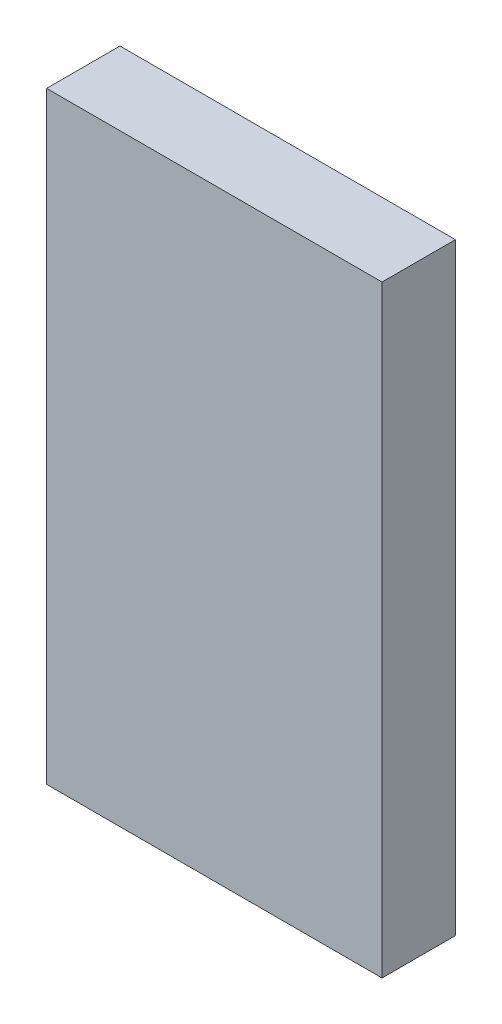
ISO-10303-21;
HEADER;
FILE_DESCRIPTION(('STEP AP214'),'2;1');
FILE_NAME('part.step','',(''),(''),'','','');
FILE_SCHEMA(('AUTOMOTIVE_DESIGN { 1 0 10303 214 1 1 1 1 }'));
ENDSEC;
DATA;
#1=APPLICATION_CONTEXT('core data for automotive mechanical design processes');
#2=APPLICATION_PROTOCOL_DEFINITION('international standard','automotive_design',2000,#1);
#3=PRODUCT_CONTEXT('',#1,'mechanical');
#4=PRODUCT('Part','Part','',(#3));
#5=PRODUCT_RELATED_PRODUCT_CATEGORY('part','',(#4));
#6=PRODUCT_DEFINITION_FORMATION('','',#4);
#7=PRODUCT_DEFINITION_CONTEXT('part definition',#1,'design');
#8=PRODUCT_DEFINITION('design','',#6,#7);
#9=PRODUCT_DEFINITION_SHAPE('','',#8);
#10=(LENGTH_UNIT() NAMED_UNIT(*) SI_UNIT(.MILLI.,.METRE.));
#11=(NAMED_UNIT(*) PLANE_ANGLE_UNIT() SI_UNIT($,.RADIAN.));
#12=(NAMED_UNIT(*) SI_UNIT($,.STERADIAN.) SOLID_ANGLE_UNIT());
#13=UNCERTAINTY_MEASURE_WITH_UNIT(LENGTH_MEASURE(1.E-05),#10,'distance_accuracy_value','');
#14=(GEOMETRIC_REPRESENTATION_CONTEXT(3) GLOBAL_UNCERTAINTY_ASSIGNED_CONTEXT((#13)) GLOBAL_UNIT_ASSIGNED_CONTEXT((#10,
#11,#12)) REPRESENTATION_CONTEXT('',''));
#15=CARTESIAN_POINT('',(0.,0.,0.));
#16=DIRECTION('',(0.,0.,1.));
#17=DIRECTION('',(1.,0.,0.));
#18=AXIS2_PLACEMENT_3D('',#15,#16,#17);
#19=CARTESIAN_POINT('',(0.,0.,2.8));
#20=DIRECTION('',(1.,0.,0.));
#21=DIRECTION('',(0.,0.,-1.));
#22=AXIS2_PLACEMENT_3D('',#19,#20,#21);
#23=PLANE('',#22);
#24=DIRECTION('',(0.,-1.,0.));
#25=VECTOR('',#24,1.);
#26=CARTESIAN_POINT('',(0.,0.,0.));
#27=LINE('',#26,#25);
#28=CARTESIAN_POINT('',(0.,23.,0.));
#29=VERTEX_POINT('',#28);
#30=CARTESIAN_POINT('',(0.,0.,0.));
#31=VERTEX_POINT('',#30);
#32=EDGE_CURVE('E96',#29,#31,#27,.T.);
#33=ORIENTED_EDGE('',*,*,#32,.T.);
#34=DIRECTION('',(0.,0.,-1.));
#35=VECTOR('',#34,1.);
#36=CARTESIAN_POINT('',(0.,0.,2.8));
#37=LINE('',#36,#35);
#38=CARTESIAN_POINT('',(0.,0.,2.8));
#39=VERTEX_POINT('',#38);
#40=EDGE_CURVE('E11',#39,#31,#37,.T.);
#41=ORIENTED_EDGE('',*,*,#40,.F.);
#42=DIRECTION('',(0.,-1.,0.));
#43=VECTOR('',#42,1.);
#44=CARTESIAN_POINT('',(0.,0.,2.8));
#45=LINE('',#44,#43);
#46=CARTESIAN_POINT('',(0.,23.,2.8));
#47=VERTEX_POINT('',#46);
#48=EDGE_CURVE('E84',#47,#39,#45,.T.);
#49=ORIENTED_EDGE('',*,*,#48,.F.);
#50=DIRECTION('',(0.,0.,-1.));
#51=VECTOR('',#50,1.);
#52=CARTESIAN_POINT('',(0.,23.,2.8));
#53=LINE('',#52,#51);
#54=EDGE_CURVE('E92',#47,#29,#53,.T.);
#55=ORIENTED_EDGE('',*,*,#54,.T.);
#56=EDGE_LOOP('',(#33,#41,#49,#55));
#57=FACE_BOUND('',#56,.T.);
#58=ADVANCED_FACE('F33',(#57),#23,.F.);
#59=CARTESIAN_POINT('',(0.,0.,2.8));
#60=DIRECTION('',(0.,1.,0.));
#61=DIRECTION('',(0.,0.,1.));
#62=AXIS2_PLACEMENT_3D('',#59,#60,#61);
#63=PLANE('',#62);
#64=DIRECTION('',(1.,0.,0.));
#65=VECTOR('',#64,1.);
#66=CARTESIAN_POINT('',(0.,0.,0.));
#67=LINE('',#66,#65);
#68=CARTESIAN_POINT('',(12.8,0.,0.));
#69=VERTEX_POINT('',#68);
#70=EDGE_CURVE('E88',#31,#69,#67,.T.);
#71=ORIENTED_EDGE('',*,*,#70,.T.);
#72=DIRECTION('',(0.,0.,-1.));
#73=VECTOR('',#72,1.);
#74=CARTESIAN_POINT('',(12.8,0.,2.8));
#75=LINE('',#74,#73);
#76=CARTESIAN_POINT('',(12.8,0.,2.8));
#77=VERTEX_POINT('',#76);
#78=EDGE_CURVE('E41',#77,#69,#75,.T.);
#79=ORIENTED_EDGE('',*,*,#78,.F.);
#80=DIRECTION('',(1.,0.,0.));
#81=VECTOR('',#80,1.);
#82=CARTESIAN_POINT('',(0.,0.,2.8));
#83=LINE('',#82,#81);
#84=EDGE_CURVE('E79',#39,#77,#83,.T.);
#85=ORIENTED_EDGE('',*,*,#84,.F.);
#86=ORIENTED_EDGE('',*,*,#40,.T.);
#87=EDGE_LOOP('',(#71,#79,#85,#86));
#88=FACE_BOUND('',#87,.T.);
#89=ADVANCED_FACE('F87',(#88),#63,.F.);
#90=CARTESIAN_POINT('',(12.8,0.,2.8));
#91=DIRECTION('',(-1.,0.,0.));
#92=DIRECTION('',(0.,-1.,0.));
#93=AXIS2_PLACEMENT_3D('',#90,#91,#92);
#94=PLANE('',#93);
#95=DIRECTION('',(0.,1.,0.));
#96=VECTOR('',#95,1.);
#97=CARTESIAN_POINT('',(12.8,0.,0.));
#98=LINE('',#97,#96);
#99=CARTESIAN_POINT('',(12.8,23.,0.));
#100=VERTEX_POINT('',#99);
#101=EDGE_CURVE('E66',#69,#100,#98,.T.);
#102=ORIENTED_EDGE('',*,*,#101,.T.);
#103=DIRECTION('',(0.,0.,-1.));
#104=VECTOR('',#103,1.);
#105=CARTESIAN_POINT('',(12.8,23.,2.8));
#106=LINE('',#105,#104);
#107=CARTESIAN_POINT('',(12.8,23.,2.8));
#108=VERTEX_POINT('',#107);
#109=EDGE_CURVE('E89',#108,#100,#106,.T.);
#110=ORIENTED_EDGE('',*,*,#109,.F.);
#111=DIRECTION('',(0.,1.,0.));
#112=VECTOR('',#111,1.);
#113=CARTESIAN_POINT('',(12.8,0.,2.8));
#114=LINE('',#113,#112);
#115=EDGE_CURVE('E82',#77,#108,#114,.T.);
#116=ORIENTED_EDGE('',*,*,#115,.F.);
#117=ORIENTED_EDGE('',*,*,#78,.T.);
#118=EDGE_LOOP('',(#102,#110,#116,#117));
#119=FACE_BOUND('',#118,.T.);
#120=ADVANCED_FACE('F90',(#119),#94,.F.);
#121=CARTESIAN_POINT('',(0.,23.,2.8));
#122=DIRECTION('',(0.,-1.,0.));
#123=DIRECTION('',(0.,0.,-1.));
#124=AXIS2_PLACEMENT_3D('',#121,#122,#123);
#125=PLANE('',#124);
#126=DIRECTION('',(-1.,0.,0.));
#127=VECTOR('',#126,1.);
#128=CARTESIAN_POINT('',(0.,23.,0.));
#129=LINE('',#128,#127);
#130=EDGE_CURVE('E72',#100,#29,#129,.T.);
#131=ORIENTED_EDGE('',*,*,#130,.T.);
#132=ORIENTED_EDGE('',*,*,#54,.F.);
#133=DIRECTION('',(-1.,0.,0.));
#134=VECTOR('',#133,1.);
#135=CARTESIAN_POINT('',(0.,23.,2.8));
#136=LINE('',#135,#134);
#137=EDGE_CURVE('E49',#108,#47,#136,.T.);
#138=ORIENTED_EDGE('',*,*,#137,.F.);
#139=ORIENTED_EDGE('',*,*,#109,.T.);
#140=EDGE_LOOP('',(#131,#132,#138,#139));
#141=FACE_BOUND('',#140,.T.);
#142=ADVANCED_FACE('F103',(#141),#125,.F.);
#143=CARTESIAN_POINT('',(0.,0.,2.8));
#144=DIRECTION('',(0.,0.,-1.));
#145=DIRECTION('',(-1.,0.,0.));
#146=AXIS2_PLACEMENT_3D('',#143,#144,#145);
#147=PLANE('',#146);
#148=ORIENTED_EDGE('',*,*,#48,.T.);
#149=ORIENTED_EDGE('',*,*,#84,.T.);
#150=ORIENTED_EDGE('',*,*,#115,.T.);
#151=ORIENTED_EDGE('',*,*,#137,.T.);
#152=EDGE_LOOP('',(#148,#149,#150,#151));
#153=FACE_BOUND('',#152,.T.);
#154=ADVANCED_FACE('F80',(#153),#147,.F.);
#155=CARTESIAN_POINT('',(0.,0.,0.));
#156=DIRECTION('',(0.,0.,-1.));
#157=DIRECTION('',(-1.,0.,0.));
#158=AXIS2_PLACEMENT_3D('',#155,#156,#157);
#159=PLANE('',#158);
#160=ORIENTED_EDGE('',*,*,#32,.F.);
#161=ORIENTED_EDGE('',*,*,#130,.F.);
#162=ORIENTED_EDGE('',*,*,#101,.F.);
#163=ORIENTED_EDGE('',*,*,#70,.F.);
#164=EDGE_LOOP('',(#160,#161,#162,#163));
#165=FACE_BOUND('',#164,.T.);
#166=ADVANCED_FACE('F106',(#165),#159,.T.);
#167=CLOSED_SHELL('',(#58,#89,#120,#142,#154,#166));
#168=MANIFOLD_SOLID_BREP('B2',#167);
#169=ADVANCED_BREP_SHAPE_REPRESENTATION('',(#18,#168),#14);
#170=SHAPE_DEFINITION_REPRESENTATION(#9,#169);
ENDSEC;
END-ISO-10303-21;
